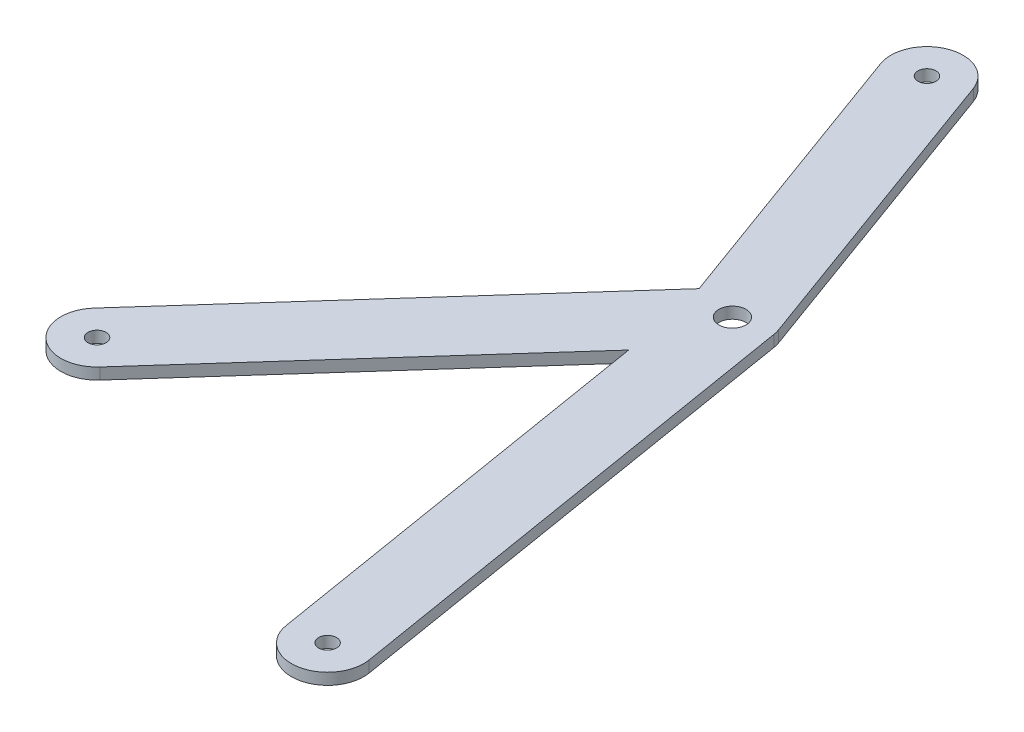
ISO-10303-21;
HEADER;
FILE_DESCRIPTION(('STEP AP214'),'2;1');
FILE_NAME('part.step','',(''),(''),'','','');
FILE_SCHEMA(('AUTOMOTIVE_DESIGN { 1 0 10303 214 1 1 1 1 }'));
ENDSEC;
DATA;
#1=APPLICATION_CONTEXT('core data for automotive mechanical design processes');
#2=APPLICATION_PROTOCOL_DEFINITION('international standard','automotive_design',2000,#1);
#3=PRODUCT_CONTEXT('',#1,'mechanical');
#4=PRODUCT('Part','Part','',(#3));
#5=PRODUCT_RELATED_PRODUCT_CATEGORY('part','',(#4));
#6=PRODUCT_DEFINITION_FORMATION('','',#4);
#7=PRODUCT_DEFINITION_CONTEXT('part definition',#1,'design');
#8=PRODUCT_DEFINITION('design','',#6,#7);
#9=PRODUCT_DEFINITION_SHAPE('','',#8);
#10=(LENGTH_UNIT() NAMED_UNIT(*) SI_UNIT(.MILLI.,.METRE.));
#11=(NAMED_UNIT(*) PLANE_ANGLE_UNIT() SI_UNIT($,.RADIAN.));
#12=(NAMED_UNIT(*) SI_UNIT($,.STERADIAN.) SOLID_ANGLE_UNIT());
#13=UNCERTAINTY_MEASURE_WITH_UNIT(LENGTH_MEASURE(1.E-05),#10,'distance_accuracy_value','');
#14=(GEOMETRIC_REPRESENTATION_CONTEXT(3) GLOBAL_UNCERTAINTY_ASSIGNED_CONTEXT((#13)) GLOBAL_UNIT_ASSIGNED_CONTEXT((#10,
#11,#12)) REPRESENTATION_CONTEXT('',''));
#15=CARTESIAN_POINT('',(0.,0.,0.));
#16=DIRECTION('',(0.,0.,1.));
#17=DIRECTION('',(1.,0.,0.));
#18=AXIS2_PLACEMENT_3D('',#15,#16,#17);
#19=CARTESIAN_POINT('',(-67.0106447263582,4.,-61.3225533952196));
#20=DIRECTION('',(0.,-1.,0.));
#21=DIRECTION('',(0.,0.,-1.));
#22=AXIS2_PLACEMENT_3D('',#19,#20,#21);
#23=CYLINDRICAL_SURFACE('',#22,12.7);
#24=CARTESIAN_POINT('',(-67.0106447263582,0.,-61.3225533952196));
#25=DIRECTION('',(0.,1.,0.));
#26=DIRECTION('',(0.,0.,1.));
#27=AXIS2_PLACEMENT_3D('',#24,#25,#26);
#28=CIRCLE('',#27,12.7);
#29=CARTESIAN_POINT('',(-55.0780653913257,0.,-65.6703747362081));
#30=VERTEX_POINT('',#29);
#31=CARTESIAN_POINT('',(-78.9432240613906,0.,-56.9747320542308));
#32=VERTEX_POINT('',#31);
#33=EDGE_CURVE('E151',#30,#32,#28,.T.);
#34=ORIENTED_EDGE('',*,*,#33,.T.);
#35=DIRECTION('',(0.,-1.,0.));
#36=VECTOR('',#35,1.);
#37=CARTESIAN_POINT('',(-78.9432240613906,4.,-56.9747320542308));
#38=LINE('',#37,#36);
#39=CARTESIAN_POINT('',(-78.9432240613906,4.,-56.9747320542308));
#40=VERTEX_POINT('',#39);
#41=EDGE_CURVE('E11',#40,#32,#38,.T.);
#42=ORIENTED_EDGE('',*,*,#41,.F.);
#43=CARTESIAN_POINT('',(-67.0106447263582,4.,-61.3225533952196));
#44=DIRECTION('',(0.,1.,0.));
#45=DIRECTION('',(0.,0.,1.));
#46=AXIS2_PLACEMENT_3D('',#43,#44,#45);
#47=CIRCLE('',#46,12.7);
#48=CARTESIAN_POINT('',(-55.0780653913257,4.,-65.6703747362081));
#49=VERTEX_POINT('',#48);
#50=EDGE_CURVE('E170',#49,#40,#47,.T.);
#51=ORIENTED_EDGE('',*,*,#50,.F.);
#52=DIRECTION('',(0.,-1.,0.));
#53=VECTOR('',#52,1.);
#54=CARTESIAN_POINT('',(-55.0780653913257,4.,-65.6703747362081));
#55=LINE('',#54,#53);
#56=EDGE_CURVE('E147',#49,#30,#55,.T.);
#57=ORIENTED_EDGE('',*,*,#56,.T.);
#58=EDGE_LOOP('',(#34,#42,#51,#57));
#59=FACE_BOUND('',#58,.T.);
#60=ADVANCED_FACE('F43',(#59),#23,.T.);
#61=CARTESIAN_POINT('',(-78.9432240613906,4.,-56.9747320542308));
#62=DIRECTION('',(0.939573175986812,0.,-0.342348137085708));
#63=DIRECTION('',(-0.342348137085708,0.,-0.939573175986812));
#64=AXIS2_PLACEMENT_3D('',#61,#62,#63);
#65=PLANE('',#64);
#66=DIRECTION('',(0.342348137085708,0.,0.939573175986812));
#67=VECTOR('',#66,1.);
#68=CARTESIAN_POINT('',(-78.9432240613906,0.,-56.9747320542308));
#69=LINE('',#68,#67);
#70=CARTESIAN_POINT('',(-42.3517937842619,0.,43.4503108627536));
#71=VERTEX_POINT('',#70);
#72=EDGE_CURVE('E154',#32,#71,#69,.T.);
#73=ORIENTED_EDGE('',*,*,#72,.T.);
#74=DIRECTION('',(0.,-1.,0.));
#75=VECTOR('',#74,1.);
#76=CARTESIAN_POINT('',(-42.3517937842619,4.,43.4503108627536));
#77=LINE('',#76,#75);
#78=CARTESIAN_POINT('',(-42.3517937842619,4.,43.4503108627536));
#79=VERTEX_POINT('',#78);
#80=EDGE_CURVE('E51',#79,#71,#77,.T.);
#81=ORIENTED_EDGE('',*,*,#80,.F.);
#82=DIRECTION('',(0.342348137085708,0.,0.939573175986812));
#83=VECTOR('',#82,1.);
#84=CARTESIAN_POINT('',(-78.9432240613906,4.,-56.9747320542308));
#85=LINE('',#84,#83);
#86=EDGE_CURVE('E108',#40,#79,#85,.T.);
#87=ORIENTED_EDGE('',*,*,#86,.F.);
#88=ORIENTED_EDGE('',*,*,#41,.T.);
#89=EDGE_LOOP('',(#73,#81,#87,#88));
#90=FACE_BOUND('',#89,.T.);
#91=ADVANCED_FACE('F274',(#90),#65,.F.);
#92=CARTESIAN_POINT('',(-42.3517937842619,4.,43.4503108627536));
#93=DIRECTION('',(0.745243290547027,0.,0.666792649850491));
#94=DIRECTION('',(0.666792649850491,0.,-0.745243290547027));
#95=AXIS2_PLACEMENT_3D('',#92,#93,#94);
#96=PLANE('',#95);
#97=DIRECTION('',(-0.666792649850491,0.,0.745243290547027));
#98=VECTOR('',#97,1.);
#99=CARTESIAN_POINT('',(-42.3517937842619,0.,43.4503108627536));
#100=LINE('',#99,#98);
#101=CARTESIAN_POINT('',(-142.744772947681,0.,155.654898235367));
#102=VERTEX_POINT('',#101);
#103=EDGE_CURVE('E157',#71,#102,#100,.T.);
#104=ORIENTED_EDGE('',*,*,#103,.T.);
#105=DIRECTION('',(0.,-1.,0.));
#106=VECTOR('',#105,1.);
#107=CARTESIAN_POINT('',(-142.744772947681,4.,155.654898235367));
#108=LINE('',#107,#106);
#109=CARTESIAN_POINT('',(-142.744772947681,4.,155.654898235367));
#110=VERTEX_POINT('',#109);
#111=EDGE_CURVE('E183',#110,#102,#108,.T.);
#112=ORIENTED_EDGE('',*,*,#111,.F.);
#113=DIRECTION('',(-0.666792649850491,0.,0.745243290547027));
#114=VECTOR('',#113,1.);
#115=CARTESIAN_POINT('',(-42.3517937842619,4.,43.4503108627536));
#116=LINE('',#115,#114);
#117=EDGE_CURVE('E191',#79,#110,#116,.T.);
#118=ORIENTED_EDGE('',*,*,#117,.F.);
#119=ORIENTED_EDGE('',*,*,#80,.T.);
#120=EDGE_LOOP('',(#104,#112,#118,#119));
#121=FACE_BOUND('',#120,.T.);
#122=ADVANCED_FACE('F189',(#121),#96,.F.);
#123=CARTESIAN_POINT('',(-133.280183157734,4.,164.123164888468));
#124=DIRECTION('',(0.,-1.,0.));
#125=DIRECTION('',(0.,0.,-1.));
#126=AXIS2_PLACEMENT_3D('',#123,#124,#125);
#127=CYLINDRICAL_SURFACE('',#126,12.7);
#128=CARTESIAN_POINT('',(-133.280183157734,0.,164.123164888468));
#129=DIRECTION('',(0.,1.,0.));
#130=DIRECTION('',(0.,0.,1.));
#131=AXIS2_PLACEMENT_3D('',#128,#129,#130);
#132=CIRCLE('',#131,12.7);
#133=CARTESIAN_POINT('',(-123.815593367787,0.,172.591431541569));
#134=VERTEX_POINT('',#133);
#135=EDGE_CURVE('E159',#102,#134,#132,.T.);
#136=ORIENTED_EDGE('',*,*,#135,.T.);
#137=DIRECTION('',(0.,-1.,0.));
#138=VECTOR('',#137,1.);
#139=CARTESIAN_POINT('',(-123.815593367787,4.,172.591431541569));
#140=LINE('',#139,#138);
#141=CARTESIAN_POINT('',(-123.815593367787,4.,172.591431541569));
#142=VERTEX_POINT('',#141);
#143=EDGE_CURVE('E180',#142,#134,#140,.T.);
#144=ORIENTED_EDGE('',*,*,#143,.F.);
#145=CARTESIAN_POINT('',(-133.280183157734,4.,164.123164888468));
#146=DIRECTION('',(0.,1.,0.));
#147=DIRECTION('',(0.,0.,1.));
#148=AXIS2_PLACEMENT_3D('',#145,#146,#147);
#149=CIRCLE('',#148,12.7);
#150=EDGE_CURVE('E209',#110,#142,#149,.T.);
#151=ORIENTED_EDGE('',*,*,#150,.F.);
#152=ORIENTED_EDGE('',*,*,#111,.T.);
#153=EDGE_LOOP('',(#136,#144,#151,#152));
#154=FACE_BOUND('',#153,.T.);
#155=ADVANCED_FACE('F200',(#154),#127,.T.);
#156=CARTESIAN_POINT('',(-36.0448907355709,4.,74.4941785830614));
#157=DIRECTION('',(-0.745243290547029,0.,-0.666792649850489));
#158=DIRECTION('',(-0.666792649850489,0.,0.745243290547029));
#159=AXIS2_PLACEMENT_3D('',#156,#157,#158);
#160=PLANE('',#159);
#161=DIRECTION('',(0.666792649850489,0.,-0.745243290547029));
#162=VECTOR('',#161,1.);
#163=CARTESIAN_POINT('',(-36.0448907355709,0.,74.4941785830614));
#164=LINE('',#163,#162);
#165=CARTESIAN_POINT('',(-36.0448907355709,0.,74.4941785830614));
#166=VERTEX_POINT('',#165);
#167=EDGE_CURVE('E161',#134,#166,#164,.T.);
#168=ORIENTED_EDGE('',*,*,#167,.T.);
#169=DIRECTION('',(0.,-1.,0.));
#170=VECTOR('',#169,1.);
#171=CARTESIAN_POINT('',(-36.0448907355709,4.,74.4941785830614));
#172=LINE('',#171,#170);
#173=CARTESIAN_POINT('',(-36.0448907355709,4.,74.4941785830614));
#174=VERTEX_POINT('',#173);
#175=EDGE_CURVE('E177',#174,#166,#172,.T.);
#176=ORIENTED_EDGE('',*,*,#175,.F.);
#177=DIRECTION('',(0.666792649850489,0.,-0.745243290547029));
#178=VECTOR('',#177,1.);
#179=CARTESIAN_POINT('',(-36.0448907355709,4.,74.4941785830614));
#180=LINE('',#179,#178);
#181=EDGE_CURVE('E206',#142,#174,#180,.T.);
#182=ORIENTED_EDGE('',*,*,#181,.F.);
#183=ORIENTED_EDGE('',*,*,#143,.T.);
#184=EDGE_LOOP('',(#168,#176,#182,#183));
#185=FACE_BOUND('',#184,.T.);
#186=ADVANCED_FACE('F204',(#185),#160,.F.);
#187=CARTESIAN_POINT('',(-36.0448907355709,4.,74.4941785830614));
#188=DIRECTION('',(0.986770965571771,0.,-0.162120515372221));
#189=DIRECTION('',(-0.162120515372221,0.,-0.986770965571771));
#190=AXIS2_PLACEMENT_3D('',#187,#188,#189);
#191=PLANE('',#190);
#192=DIRECTION('',(0.162120515372221,0.,0.986770965571771));
#193=VECTOR('',#192,1.);
#194=CARTESIAN_POINT('',(-36.0448907355709,0.,74.4941785830614));
#195=LINE('',#194,#193);
#196=CARTESIAN_POINT('',(-12.3728314254372,0.,218.577737464563));
#197=VERTEX_POINT('',#196);
#198=EDGE_CURVE('E163',#166,#197,#195,.T.);
#199=ORIENTED_EDGE('',*,*,#198,.T.);
#200=DIRECTION('',(0.,-1.,0.));
#201=VECTOR('',#200,1.);
#202=CARTESIAN_POINT('',(-12.3728314254372,4.,218.577737464563));
#203=LINE('',#202,#201);
#204=CARTESIAN_POINT('',(-12.3728314254372,4.,218.577737464563));
#205=VERTEX_POINT('',#204);
#206=EDGE_CURVE('E174',#205,#197,#203,.T.);
#207=ORIENTED_EDGE('',*,*,#206,.F.);
#208=DIRECTION('',(0.162120515372221,0.,0.986770965571771));
#209=VECTOR('',#208,1.);
#210=CARTESIAN_POINT('',(-36.0448907355709,4.,74.4941785830614));
#211=LINE('',#210,#209);
#212=EDGE_CURVE('E208',#174,#205,#211,.T.);
#213=ORIENTED_EDGE('',*,*,#212,.F.);
#214=ORIENTED_EDGE('',*,*,#175,.T.);
#215=EDGE_LOOP('',(#199,#207,#213,#214));
#216=FACE_BOUND('',#215,.T.);
#217=ADVANCED_FACE('F286',(#216),#191,.F.);
#218=CARTESIAN_POINT('',(0.159159837328364,4.,216.518806919335));
#219=DIRECTION('',(0.,-1.,0.));
#220=DIRECTION('',(0.,0.,-1.));
#221=AXIS2_PLACEMENT_3D('',#218,#219,#220);
#222=CYLINDRICAL_SURFACE('',#221,12.7000000000041);
#223=CARTESIAN_POINT('',(0.159159837328364,0.,216.518806919335));
#224=DIRECTION('',(0.,1.,0.));
#225=DIRECTION('',(0.,0.,1.));
#226=AXIS2_PLACEMENT_3D('',#223,#224,#225);
#227=CIRCLE('',#226,12.7000000000041);
#228=CARTESIAN_POINT('',(12.6911511000939,0.,214.459876374107));
#229=VERTEX_POINT('',#228);
#230=EDGE_CURVE('E165',#197,#229,#227,.T.);
#231=ORIENTED_EDGE('',*,*,#230,.T.);
#232=DIRECTION('',(0.,-1.,0.));
#233=VECTOR('',#232,1.);
#234=CARTESIAN_POINT('',(12.6911511000939,4.,214.459876374107));
#235=LINE('',#234,#233);
#236=CARTESIAN_POINT('',(12.6911511000939,4.,214.459876374107));
#237=VERTEX_POINT('',#236);
#238=EDGE_CURVE('E142',#237,#229,#235,.T.);
#239=ORIENTED_EDGE('',*,*,#238,.F.);
#240=CARTESIAN_POINT('',(0.159159837328364,4.,216.518806919335));
#241=DIRECTION('',(0.,1.,0.));
#242=DIRECTION('',(0.,0.,1.));
#243=AXIS2_PLACEMENT_3D('',#240,#241,#242);
#244=CIRCLE('',#243,12.7000000000041);
#245=EDGE_CURVE('E133',#205,#237,#244,.T.);
#246=ORIENTED_EDGE('',*,*,#245,.F.);
#247=ORIENTED_EDGE('',*,*,#206,.T.);
#248=EDGE_LOOP('',(#231,#239,#246,#247));
#249=FACE_BOUND('',#248,.T.);
#250=ADVANCED_FACE('F283',(#249),#222,.T.);
#251=CARTESIAN_POINT('',(-15.2830440745856,4.,44.1907187648711));
#252=DIRECTION('',(-0.986770965571763,0.,0.162120515372269));
#253=DIRECTION('',(0.162120515372269,0.,0.986770965571763));
#254=AXIS2_PLACEMENT_3D('',#251,#252,#253);
#255=PLANE('',#254);
#256=DIRECTION('',(-0.162120515372269,0.,-0.986770965571763));
#257=VECTOR('',#256,1.);
#258=CARTESIAN_POINT('',(-15.2830440745856,0.,44.1907187648711));
#259=LINE('',#258,#257);
#260=CARTESIAN_POINT('',(-15.2830440745856,0.,44.1907187648711));
#261=VERTEX_POINT('',#260);
#262=EDGE_CURVE('E141',#229,#261,#259,.T.);
#263=ORIENTED_EDGE('',*,*,#262,.T.);
#264=DIRECTION('',(0.,-1.,0.));
#265=VECTOR('',#264,1.);
#266=CARTESIAN_POINT('',(-15.2830440745856,4.,44.1907187648711));
#267=LINE('',#266,#265);
#268=CARTESIAN_POINT('',(-15.2830440745856,4.,44.1907187648711));
#269=VERTEX_POINT('',#268);
#270=EDGE_CURVE('E138',#269,#261,#267,.T.);
#271=ORIENTED_EDGE('',*,*,#270,.F.);
#272=DIRECTION('',(-0.162120515372269,0.,-0.986770965571763));
#273=VECTOR('',#272,1.);
#274=CARTESIAN_POINT('',(-15.2830440745856,4.,44.1907187648711));
#275=LINE('',#274,#273);
#276=EDGE_CURVE('E127',#237,#269,#275,.T.);
#277=ORIENTED_EDGE('',*,*,#276,.F.);
#278=ORIENTED_EDGE('',*,*,#238,.T.);
#279=EDGE_LOOP('',(#263,#271,#277,#278));
#280=FACE_BOUND('',#279,.T.);
#281=ADVANCED_FACE('F139',(#280),#255,.F.);
#282=CARTESIAN_POINT('',(-27.8150353373511,4.,46.2496493100997));
#283=DIRECTION('',(0.,-1.,0.));
#284=DIRECTION('',(0.,0.,-1.));
#285=AXIS2_PLACEMENT_3D('',#282,#283,#284);
#286=CYLINDRICAL_SURFACE('',#285,12.7000000000042);
#287=CARTESIAN_POINT('',(-27.8150353373511,0.,46.2496493100997));
#288=DIRECTION('',(0.,1.,0.));
#289=DIRECTION('',(0.,0.,-1.));
#290=AXIS2_PLACEMENT_3D('',#287,#288,#289);
#291=CIRCLE('',#290,12.7000000000042);
#292=CARTESIAN_POINT('',(-15.8824560023146,0.,41.9018279691098));
#293=VERTEX_POINT('',#292);
#294=EDGE_CURVE('E94',#261,#293,#291,.T.);
#295=ORIENTED_EDGE('',*,*,#294,.T.);
#296=DIRECTION('',(0.,-1.,0.));
#297=VECTOR('',#296,1.);
#298=CARTESIAN_POINT('',(-15.8824560023146,4.,41.9018279691098));
#299=LINE('',#298,#297);
#300=CARTESIAN_POINT('',(-15.8824560023146,4.,41.9018279691098));
#301=VERTEX_POINT('',#300);
#302=EDGE_CURVE('E143',#301,#293,#299,.T.);
#303=ORIENTED_EDGE('',*,*,#302,.F.);
#304=CARTESIAN_POINT('',(-27.8150353373511,4.,46.2496493100997));
#305=DIRECTION('',(0.,1.,0.));
#306=DIRECTION('',(0.,0.,-1.));
#307=AXIS2_PLACEMENT_3D('',#304,#305,#306);
#308=CIRCLE('',#307,12.7000000000042);
#309=EDGE_CURVE('E131',#269,#301,#308,.T.);
#310=ORIENTED_EDGE('',*,*,#309,.F.);
#311=ORIENTED_EDGE('',*,*,#270,.T.);
#312=EDGE_LOOP('',(#295,#303,#310,#311));
#313=FACE_BOUND('',#312,.T.);
#314=ADVANCED_FACE('F145',(#313),#286,.T.);
#315=CARTESIAN_POINT('',(-55.0780653913257,4.,-65.6703747362081));
#316=DIRECTION('',(-0.939573175986813,0.,0.342348137085707));
#317=DIRECTION('',(0.342348137085707,0.,0.939573175986813));
#318=AXIS2_PLACEMENT_3D('',#315,#316,#317);
#319=PLANE('',#318);
#320=DIRECTION('',(-0.342348137085707,0.,-0.939573175986813));
#321=VECTOR('',#320,1.);
#322=CARTESIAN_POINT('',(-55.0780653913257,0.,-65.6703747362081));
#323=LINE('',#322,#321);
#324=EDGE_CURVE('E100',#293,#30,#323,.T.);
#325=ORIENTED_EDGE('',*,*,#324,.T.);
#326=ORIENTED_EDGE('',*,*,#56,.F.);
#327=DIRECTION('',(-0.342348137085707,0.,-0.939573175986813));
#328=VECTOR('',#327,1.);
#329=CARTESIAN_POINT('',(-55.0780653913257,4.,-65.6703747362081));
#330=LINE('',#329,#328);
#331=EDGE_CURVE('E59',#301,#49,#330,.T.);
#332=ORIENTED_EDGE('',*,*,#331,.F.);
#333=ORIENTED_EDGE('',*,*,#302,.T.);
#334=EDGE_LOOP('',(#325,#326,#332,#333));
#335=FACE_BOUND('',#334,.T.);
#336=ADVANCED_FACE('F252',(#335),#319,.F.);
#337=CARTESIAN_POINT('',(-67.0106447263582,4.,-61.3225533952196));
#338=DIRECTION('',(0.,1.,0.));
#339=DIRECTION('',(0.,0.,1.));
#340=AXIS2_PLACEMENT_3D('',#337,#338,#339);
#341=PLANE('',#340);
#342=CARTESIAN_POINT('',(-67.0106447263582,4.,-61.3225533952196));
#343=DIRECTION('',(0.,1.,0.));
#344=DIRECTION('',(0.,0.,1.));
#345=AXIS2_PLACEMENT_3D('',#342,#343,#344);
#346=CIRCLE('',#345,3.175);
#347=CARTESIAN_POINT('',(-67.0106447263582,4.,-58.1475533952196));
#348=VERTEX_POINT('',#347);
#349=EDGE_CURVE('E235',#348,#348,#346,.T.);
#350=ORIENTED_EDGE('',*,*,#349,.F.);
#351=EDGE_LOOP('',(#350));
#352=FACE_BOUND('',#351,.T.);
#353=CARTESIAN_POINT('',(0.159159837328364,4.,216.518806919335));
#354=DIRECTION('',(0.,1.,0.));
#355=DIRECTION('',(0.,0.,1.));
#356=AXIS2_PLACEMENT_3D('',#353,#354,#355);
#357=CIRCLE('',#356,3.175);
#358=CARTESIAN_POINT('',(0.159159837328364,4.,219.693806919335));
#359=VERTEX_POINT('',#358);
#360=EDGE_CURVE('E232',#359,#359,#357,.T.);
#361=ORIENTED_EDGE('',*,*,#360,.F.);
#362=EDGE_LOOP('',(#361));
#363=FACE_BOUND('',#362,.T.);
#364=CARTESIAN_POINT('',(-133.280183157734,4.,164.123164888468));
#365=DIRECTION('',(0.,1.,0.));
#366=DIRECTION('',(0.,0.,1.));
#367=AXIS2_PLACEMENT_3D('',#364,#365,#366);
#368=CIRCLE('',#367,3.175);
#369=CARTESIAN_POINT('',(-133.280183157734,4.,167.298164888468));
#370=VERTEX_POINT('',#369);
#371=EDGE_CURVE('E226',#370,#370,#368,.T.);
#372=ORIENTED_EDGE('',*,*,#371,.F.);
#373=EDGE_LOOP('',(#372));
#374=FACE_BOUND('',#373,.T.);
#375=CARTESIAN_POINT('',(-27.8150353373511,4.,46.2496493100997));
#376=DIRECTION('',(0.,1.,0.));
#377=DIRECTION('',(0.,0.,1.));
#378=AXIS2_PLACEMENT_3D('',#375,#376,#377);
#379=CIRCLE('',#378,4.7625);
#380=CARTESIAN_POINT('',(-27.8150353373511,4.,51.0121493100997));
#381=VERTEX_POINT('',#380);
#382=EDGE_CURVE('E217',#381,#381,#379,.T.);
#383=ORIENTED_EDGE('',*,*,#382,.F.);
#384=EDGE_LOOP('',(#383));
#385=FACE_BOUND('',#384,.T.);
#386=ORIENTED_EDGE('',*,*,#50,.T.);
#387=ORIENTED_EDGE('',*,*,#86,.T.);
#388=ORIENTED_EDGE('',*,*,#117,.T.);
#389=ORIENTED_EDGE('',*,*,#150,.T.);
#390=ORIENTED_EDGE('',*,*,#181,.T.);
#391=ORIENTED_EDGE('',*,*,#212,.T.);
#392=ORIENTED_EDGE('',*,*,#245,.T.);
#393=ORIENTED_EDGE('',*,*,#276,.T.);
#394=ORIENTED_EDGE('',*,*,#309,.T.);
#395=ORIENTED_EDGE('',*,*,#331,.T.);
#396=EDGE_LOOP('',(#386,#387,#388,#389,#390,#391,#392,#393,#394,#395));
#397=FACE_BOUND('',#396,.T.);
#398=ADVANCED_FACE('F129',(#352,#363,#374,#385,#397),#341,.T.);
#399=CARTESIAN_POINT('',(-67.0106447263582,0.,-61.3225533952196));
#400=DIRECTION('',(0.,1.,0.));
#401=DIRECTION('',(0.,0.,1.));
#402=AXIS2_PLACEMENT_3D('',#399,#400,#401);
#403=PLANE('',#402);
#404=CARTESIAN_POINT('',(-67.0106447263582,0.,-61.3225533952196));
#405=DIRECTION('',(0.,1.,0.));
#406=DIRECTION('',(0.,0.,1.));
#407=AXIS2_PLACEMENT_3D('',#404,#405,#406);
#408=CIRCLE('',#407,3.175);
#409=CARTESIAN_POINT('',(-67.0106447263582,0.,-58.1475533952196));
#410=VERTEX_POINT('',#409);
#411=EDGE_CURVE('E220',#410,#410,#408,.T.);
#412=ORIENTED_EDGE('',*,*,#411,.T.);
#413=EDGE_LOOP('',(#412));
#414=FACE_BOUND('',#413,.T.);
#415=CARTESIAN_POINT('',(0.159159837328364,0.,216.518806919335));
#416=DIRECTION('',(0.,1.,0.));
#417=DIRECTION('',(0.,0.,1.));
#418=AXIS2_PLACEMENT_3D('',#415,#416,#417);
#419=CIRCLE('',#418,3.175);
#420=CARTESIAN_POINT('',(0.159159837328364,0.,219.693806919335));
#421=VERTEX_POINT('',#420);
#422=EDGE_CURVE('E229',#421,#421,#419,.T.);
#423=ORIENTED_EDGE('',*,*,#422,.T.);
#424=EDGE_LOOP('',(#423));
#425=FACE_BOUND('',#424,.T.);
#426=CARTESIAN_POINT('',(-133.280183157734,0.,164.123164888468));
#427=DIRECTION('',(0.,1.,0.));
#428=DIRECTION('',(0.,0.,1.));
#429=AXIS2_PLACEMENT_3D('',#426,#427,#428);
#430=CIRCLE('',#429,3.175);
#431=CARTESIAN_POINT('',(-133.280183157734,0.,167.298164888468));
#432=VERTEX_POINT('',#431);
#433=EDGE_CURVE('E223',#432,#432,#430,.T.);
#434=ORIENTED_EDGE('',*,*,#433,.T.);
#435=EDGE_LOOP('',(#434));
#436=FACE_BOUND('',#435,.T.);
#437=CARTESIAN_POINT('',(-27.8150353373511,0.,46.2496493100997));
#438=DIRECTION('',(0.,1.,0.));
#439=DIRECTION('',(0.,0.,1.));
#440=AXIS2_PLACEMENT_3D('',#437,#438,#439);
#441=CIRCLE('',#440,4.7625);
#442=CARTESIAN_POINT('',(-27.8150353373511,0.,51.0121493100997));
#443=VERTEX_POINT('',#442);
#444=EDGE_CURVE('E155',#443,#443,#441,.T.);
#445=ORIENTED_EDGE('',*,*,#444,.T.);
#446=EDGE_LOOP('',(#445));
#447=FACE_BOUND('',#446,.T.);
#448=ORIENTED_EDGE('',*,*,#33,.F.);
#449=ORIENTED_EDGE('',*,*,#324,.F.);
#450=ORIENTED_EDGE('',*,*,#294,.F.);
#451=ORIENTED_EDGE('',*,*,#262,.F.);
#452=ORIENTED_EDGE('',*,*,#230,.F.);
#453=ORIENTED_EDGE('',*,*,#198,.F.);
#454=ORIENTED_EDGE('',*,*,#167,.F.);
#455=ORIENTED_EDGE('',*,*,#135,.F.);
#456=ORIENTED_EDGE('',*,*,#103,.F.);
#457=ORIENTED_EDGE('',*,*,#72,.F.);
#458=EDGE_LOOP('',(#448,#449,#450,#451,#452,#453,#454,#455,#456,#457));
#459=FACE_BOUND('',#458,.T.);
#460=ADVANCED_FACE('F195',(#414,#425,#436,#447,#459),#403,.F.);
#461=CARTESIAN_POINT('',(-27.8150353373511,0.,46.2496493100997));
#462=DIRECTION('',(0.,1.,0.));
#463=DIRECTION('',(0.,0.,1.));
#464=AXIS2_PLACEMENT_3D('',#461,#462,#463);
#465=CYLINDRICAL_SURFACE('',#464,4.7625);
#466=ORIENTED_EDGE('',*,*,#444,.F.);
#467=EDGE_LOOP('',(#466));
#468=FACE_BOUND('',#467,.T.);
#469=ORIENTED_EDGE('',*,*,#382,.T.);
#470=EDGE_LOOP('',(#469));
#471=FACE_BOUND('',#470,.T.);
#472=ADVANCED_FACE('F260',(#468,#471),#465,.F.);
#473=CARTESIAN_POINT('',(-133.280183157734,0.,164.123164888468));
#474=DIRECTION('',(0.,1.,0.));
#475=DIRECTION('',(0.,0.,1.));
#476=AXIS2_PLACEMENT_3D('',#473,#474,#475);
#477=CYLINDRICAL_SURFACE('',#476,3.175);
#478=ORIENTED_EDGE('',*,*,#433,.F.);
#479=EDGE_LOOP('',(#478));
#480=FACE_BOUND('',#479,.T.);
#481=ORIENTED_EDGE('',*,*,#371,.T.);
#482=EDGE_LOOP('',(#481));
#483=FACE_BOUND('',#482,.T.);
#484=ADVANCED_FACE('F262',(#480,#483),#477,.F.);
#485=CARTESIAN_POINT('',(0.159159837328364,0.,216.518806919335));
#486=DIRECTION('',(0.,1.,0.));
#487=DIRECTION('',(0.,0.,1.));
#488=AXIS2_PLACEMENT_3D('',#485,#486,#487);
#489=CYLINDRICAL_SURFACE('',#488,3.175);
#490=ORIENTED_EDGE('',*,*,#422,.F.);
#491=EDGE_LOOP('',(#490));
#492=FACE_BOUND('',#491,.T.);
#493=ORIENTED_EDGE('',*,*,#360,.T.);
#494=EDGE_LOOP('',(#493));
#495=FACE_BOUND('',#494,.T.);
#496=ADVANCED_FACE('F246',(#492,#495),#489,.F.);
#497=CARTESIAN_POINT('',(-67.0106447263582,0.,-61.3225533952196));
#498=DIRECTION('',(0.,1.,0.));
#499=DIRECTION('',(0.,0.,1.));
#500=AXIS2_PLACEMENT_3D('',#497,#498,#499);
#501=CYLINDRICAL_SURFACE('',#500,3.175);
#502=ORIENTED_EDGE('',*,*,#411,.F.);
#503=EDGE_LOOP('',(#502));
#504=FACE_BOUND('',#503,.T.);
#505=ORIENTED_EDGE('',*,*,#349,.T.);
#506=EDGE_LOOP('',(#505));
#507=FACE_BOUND('',#506,.T.);
#508=ADVANCED_FACE('F243',(#504,#507),#501,.F.);
#509=CLOSED_SHELL('',(#60,#91,#122,#155,#186,#217,#250,#281,#314,#336,#398,#460,#472,#484,#496,#508));
#510=MANIFOLD_SOLID_BREP('B2',#509);
#511=ADVANCED_BREP_SHAPE_REPRESENTATION('',(#18,#510),#14);
#512=SHAPE_DEFINITION_REPRESENTATION(#9,#511);
ENDSEC;
END-ISO-10303-21;
